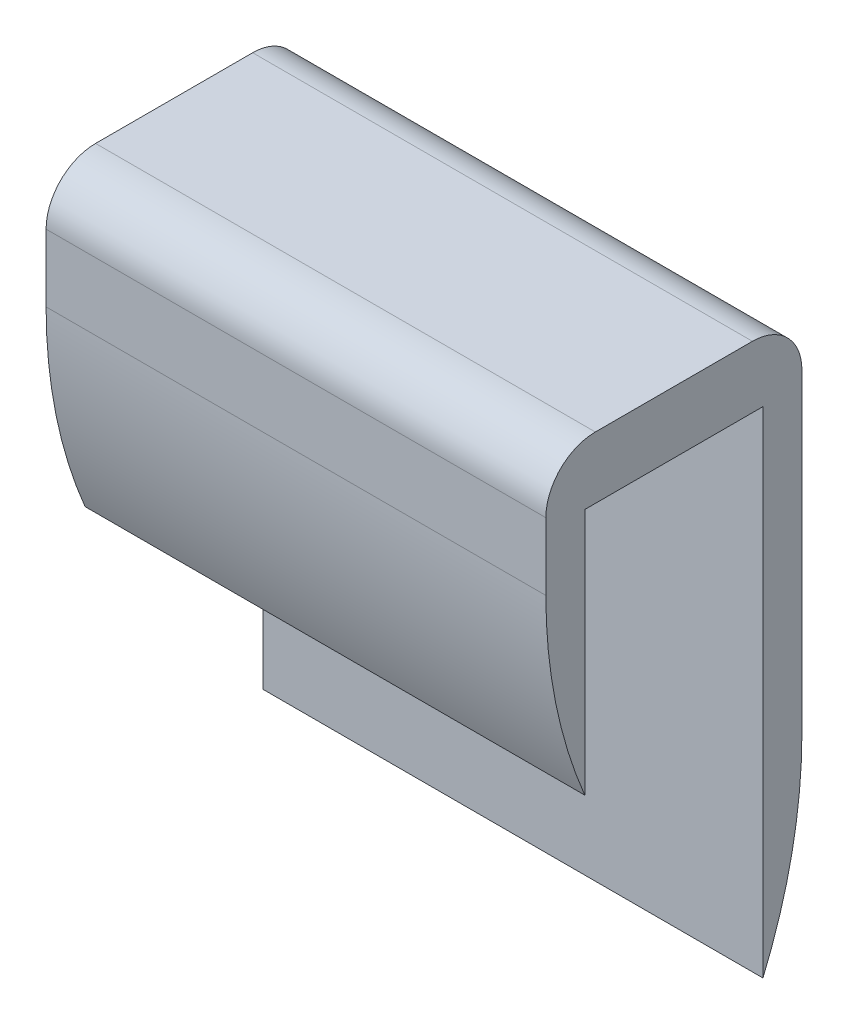
ISO-10303-21;
HEADER;
FILE_DESCRIPTION(('STEP AP214'),'2;1');
FILE_NAME('part.step','',(''),(''),'','','');
FILE_SCHEMA(('AUTOMOTIVE_DESIGN { 1 0 10303 214 1 1 1 1 }'));
ENDSEC;
DATA;
#1=APPLICATION_CONTEXT('core data for automotive mechanical design processes');
#2=APPLICATION_PROTOCOL_DEFINITION('international standard','automotive_design',2000,#1);
#3=PRODUCT_CONTEXT('',#1,'mechanical');
#4=PRODUCT('Part','Part','',(#3));
#5=PRODUCT_RELATED_PRODUCT_CATEGORY('part','',(#4));
#6=PRODUCT_DEFINITION_FORMATION('','',#4);
#7=PRODUCT_DEFINITION_CONTEXT('part definition',#1,'design');
#8=PRODUCT_DEFINITION('design','',#6,#7);
#9=PRODUCT_DEFINITION_SHAPE('','',#8);
#10=(LENGTH_UNIT() NAMED_UNIT(*) SI_UNIT(.MILLI.,.METRE.));
#11=(NAMED_UNIT(*) PLANE_ANGLE_UNIT() SI_UNIT($,.RADIAN.));
#12=(NAMED_UNIT(*) SI_UNIT($,.STERADIAN.) SOLID_ANGLE_UNIT());
#13=UNCERTAINTY_MEASURE_WITH_UNIT(LENGTH_MEASURE(1.E-05),#10,'distance_accuracy_value','');
#14=(GEOMETRIC_REPRESENTATION_CONTEXT(3) GLOBAL_UNCERTAINTY_ASSIGNED_CONTEXT((#13)) GLOBAL_UNIT_ASSIGNED_CONTEXT((#10,
#11,#12)) REPRESENTATION_CONTEXT('',''));
#15=CARTESIAN_POINT('',(0.,0.,0.));
#16=DIRECTION('',(0.,0.,1.));
#17=DIRECTION('',(1.,0.,0.));
#18=AXIS2_PLACEMENT_3D('',#15,#16,#17);
#19=CARTESIAN_POINT('',(25.654,3.175,6.572));
#20=DIRECTION('',(0.,0.,-1.));
#21=DIRECTION('',(0.,1.,0.));
#22=AXIS2_PLACEMENT_3D('',#19,#20,#21);
#23=PLANE('',#22);
#24=DIRECTION('',(0.,-1.,0.));
#25=VECTOR('',#24,1.);
#26=CARTESIAN_POINT('',(25.654,3.175,6.572));
#27=LINE('',#26,#25);
#28=CARTESIAN_POINT('',(25.654,0.634999999999998,6.572));
#29=VERTEX_POINT('',#28);
#30=CARTESIAN_POINT('',(25.654,-2.82072877181723,6.572));
#31=VERTEX_POINT('',#30);
#32=EDGE_CURVE('E116',#29,#31,#27,.T.);
#33=ORIENTED_EDGE('',*,*,#32,.F.);
#34=DIRECTION('',(-1.,0.,0.));
#35=VECTOR('',#34,1.);
#36=CARTESIAN_POINT('',(25.654,0.634999999999998,6.572));
#37=LINE('',#36,#35);
#38=CARTESIAN_POINT('',(0.,0.634999999999998,6.572));
#39=VERTEX_POINT('',#38);
#40=EDGE_CURVE('E11',#29,#39,#37,.T.);
#41=ORIENTED_EDGE('',*,*,#40,.T.);
#42=DIRECTION('',(0.,-1.,0.));
#43=VECTOR('',#42,1.);
#44=CARTESIAN_POINT('',(0.,3.175,6.572));
#45=LINE('',#44,#43);
#46=CARTESIAN_POINT('',(0.,-2.82072877181723,6.572));
#47=VERTEX_POINT('',#46);
#48=EDGE_CURVE('E207',#39,#47,#45,.T.);
#49=ORIENTED_EDGE('',*,*,#48,.T.);
#50=DIRECTION('',(1.,0.,0.));
#51=VECTOR('',#50,1.);
#52=CARTESIAN_POINT('',(25.654,-2.82072877181723,6.572));
#53=LINE('',#52,#51);
#54=EDGE_CURVE('E145',#47,#31,#53,.T.);
#55=ORIENTED_EDGE('',*,*,#54,.T.);
#56=EDGE_LOOP('',(#33,#41,#49,#55));
#57=FACE_BOUND('',#56,.T.);
#58=ADVANCED_FACE('F33',(#57),#23,.F.);
#59=CARTESIAN_POINT('',(25.654,-12.7,4.572));
#60=DIRECTION('',(0.,0.,1.));
#61=DIRECTION('',(1.,0.,0.));
#62=AXIS2_PLACEMENT_3D('',#59,#60,#61);
#63=PLANE('',#62);
#64=DIRECTION('',(0.,1.,0.));
#65=VECTOR('',#64,1.);
#66=CARTESIAN_POINT('',(0.,-12.7,4.572));
#67=LINE('',#66,#65);
#68=CARTESIAN_POINT('',(0.,-12.7,4.572));
#69=VERTEX_POINT('',#68);
#70=CARTESIAN_POINT('',(0.,0.,4.572));
#71=VERTEX_POINT('',#70);
#72=EDGE_CURVE('E209',#69,#71,#67,.T.);
#73=ORIENTED_EDGE('',*,*,#72,.T.);
#74=DIRECTION('',(-1.,0.,0.));
#75=VECTOR('',#74,1.);
#76=CARTESIAN_POINT('',(25.654,0.,4.572));
#77=LINE('',#76,#75);
#78=CARTESIAN_POINT('',(25.654,0.,4.572));
#79=VERTEX_POINT('',#78);
#80=EDGE_CURVE('E130',#79,#71,#77,.T.);
#81=ORIENTED_EDGE('',*,*,#80,.F.);
#82=DIRECTION('',(0.,1.,0.));
#83=VECTOR('',#82,1.);
#84=CARTESIAN_POINT('',(25.654,-12.7,4.572));
#85=LINE('',#84,#83);
#86=CARTESIAN_POINT('',(25.654,-12.7,4.572));
#87=VERTEX_POINT('',#86);
#88=EDGE_CURVE('E114',#87,#79,#85,.T.);
#89=ORIENTED_EDGE('',*,*,#88,.F.);
#90=DIRECTION('',(-1.,0.,0.));
#91=VECTOR('',#90,1.);
#92=CARTESIAN_POINT('',(25.654,-12.7,4.572));
#93=LINE('',#92,#91);
#94=EDGE_CURVE('E127',#87,#69,#93,.T.);
#95=ORIENTED_EDGE('',*,*,#94,.T.);
#96=EDGE_LOOP('',(#73,#81,#89,#95));
#97=FACE_BOUND('',#96,.T.);
#98=ADVANCED_FACE('F126',(#97),#63,.F.);
#99=CARTESIAN_POINT('',(25.654,0.,4.572));
#100=DIRECTION('',(0.,1.,0.));
#101=DIRECTION('',(0.,0.,1.));
#102=AXIS2_PLACEMENT_3D('',#99,#100,#101);
#103=PLANE('',#102);
#104=DIRECTION('',(0.,0.,-1.));
#105=VECTOR('',#104,1.);
#106=CARTESIAN_POINT('',(0.,0.,4.572));
#107=LINE('',#106,#105);
#108=CARTESIAN_POINT('',(0.,0.,-4.572));
#109=VERTEX_POINT('',#108);
#110=EDGE_CURVE('E185',#71,#109,#107,.T.);
#111=ORIENTED_EDGE('',*,*,#110,.T.);
#112=DIRECTION('',(-1.,0.,0.));
#113=VECTOR('',#112,1.);
#114=CARTESIAN_POINT('',(25.654,0.,-4.572));
#115=LINE('',#114,#113);
#116=CARTESIAN_POINT('',(25.654,0.,-4.572));
#117=VERTEX_POINT('',#116);
#118=EDGE_CURVE('E140',#117,#109,#115,.T.);
#119=ORIENTED_EDGE('',*,*,#118,.F.);
#120=DIRECTION('',(0.,0.,-1.));
#121=VECTOR('',#120,1.);
#122=CARTESIAN_POINT('',(25.654,0.,4.572));
#123=LINE('',#122,#121);
#124=EDGE_CURVE('E132',#79,#117,#123,.T.);
#125=ORIENTED_EDGE('',*,*,#124,.F.);
#126=ORIENTED_EDGE('',*,*,#80,.T.);
#127=EDGE_LOOP('',(#111,#119,#125,#126));
#128=FACE_BOUND('',#127,.T.);
#129=ADVANCED_FACE('F210',(#128),#103,.F.);
#130=CARTESIAN_POINT('',(25.654,0.,-4.572));
#131=DIRECTION('',(0.,0.,-1.));
#132=DIRECTION('',(0.,1.,0.));
#133=AXIS2_PLACEMENT_3D('',#130,#131,#132);
#134=PLANE('',#133);
#135=DIRECTION('',(0.,-1.,0.));
#136=VECTOR('',#135,1.);
#137=CARTESIAN_POINT('',(0.,0.,-4.572));
#138=LINE('',#137,#136);
#139=CARTESIAN_POINT('',(0.,-25.4,-4.572));
#140=VERTEX_POINT('',#139);
#141=EDGE_CURVE('E181',#109,#140,#138,.T.);
#142=ORIENTED_EDGE('',*,*,#141,.T.);
#143=DIRECTION('',(-1.,0.,0.));
#144=VECTOR('',#143,1.);
#145=CARTESIAN_POINT('',(25.654,-25.4,-4.572));
#146=LINE('',#145,#144);
#147=CARTESIAN_POINT('',(25.654,-25.4,-4.572));
#148=VERTEX_POINT('',#147);
#149=EDGE_CURVE('E171',#148,#140,#146,.T.);
#150=ORIENTED_EDGE('',*,*,#149,.F.);
#151=DIRECTION('',(0.,-1.,0.));
#152=VECTOR('',#151,1.);
#153=CARTESIAN_POINT('',(25.654,0.,-4.572));
#154=LINE('',#153,#152);
#155=EDGE_CURVE('E197',#117,#148,#154,.T.);
#156=ORIENTED_EDGE('',*,*,#155,.F.);
#157=ORIENTED_EDGE('',*,*,#118,.T.);
#158=EDGE_LOOP('',(#142,#150,#156,#157));
#159=FACE_BOUND('',#158,.T.);
#160=ADVANCED_FACE('F195',(#159),#134,.F.);
#161=CARTESIAN_POINT('',(25.654,-25.4,-6.572));
#162=DIRECTION('',(0.,0.,1.));
#163=DIRECTION('',(1.,0.,0.));
#164=AXIS2_PLACEMENT_3D('',#161,#162,#163);
#165=PLANE('',#164);
#166=DIRECTION('',(0.,1.,0.));
#167=VECTOR('',#166,1.);
#168=CARTESIAN_POINT('',(0.,-25.4,-6.572));
#169=LINE('',#168,#167);
#170=CARTESIAN_POINT('',(0.,-15.5207287718172,-6.572));
#171=VERTEX_POINT('',#170);
#172=CARTESIAN_POINT('',(0.,0.635,-6.572));
#173=VERTEX_POINT('',#172);
#174=EDGE_CURVE('E177',#171,#173,#169,.T.);
#175=ORIENTED_EDGE('',*,*,#174,.T.);
#176=DIRECTION('',(-1.,0.,0.));
#177=VECTOR('',#176,1.);
#178=CARTESIAN_POINT('',(25.654,0.635,-6.572));
#179=LINE('',#178,#177);
#180=CARTESIAN_POINT('',(25.654,0.635,-6.572));
#181=VERTEX_POINT('',#180);
#182=EDGE_CURVE('E56',#173,#181,#179,.F.);
#183=ORIENTED_EDGE('',*,*,#182,.T.);
#184=DIRECTION('',(0.,1.,0.));
#185=VECTOR('',#184,1.);
#186=CARTESIAN_POINT('',(25.654,-25.4,-6.572));
#187=LINE('',#186,#185);
#188=CARTESIAN_POINT('',(25.654,-15.5207287718172,-6.572));
#189=VERTEX_POINT('',#188);
#190=EDGE_CURVE('E163',#189,#181,#187,.T.);
#191=ORIENTED_EDGE('',*,*,#190,.F.);
#192=DIRECTION('',(-1.,0.,0.));
#193=VECTOR('',#192,1.);
#194=CARTESIAN_POINT('',(25.654,-15.5207287718172,-6.572));
#195=LINE('',#194,#193);
#196=EDGE_CURVE('E121',#189,#171,#195,.T.);
#197=ORIENTED_EDGE('',*,*,#196,.T.);
#198=EDGE_LOOP('',(#175,#183,#191,#197));
#199=FACE_BOUND('',#198,.T.);
#200=ADVANCED_FACE('F179',(#199),#165,.F.);
#201=CARTESIAN_POINT('',(25.654,3.175,-6.572));
#202=DIRECTION('',(0.,-1.,0.));
#203=DIRECTION('',(0.,0.,-1.));
#204=AXIS2_PLACEMENT_3D('',#201,#202,#203);
#205=PLANE('',#204);
#206=DIRECTION('',(0.,0.,1.));
#207=VECTOR('',#206,1.);
#208=CARTESIAN_POINT('',(25.654,3.175,-6.572));
#209=LINE('',#208,#207);
#210=CARTESIAN_POINT('',(25.654,3.175,-4.032));
#211=VERTEX_POINT('',#210);
#212=CARTESIAN_POINT('',(25.654,3.175,4.032));
#213=VERTEX_POINT('',#212);
#214=EDGE_CURVE('E162',#211,#213,#209,.T.);
#215=ORIENTED_EDGE('',*,*,#214,.F.);
#216=DIRECTION('',(-1.,0.,0.));
#217=VECTOR('',#216,1.);
#218=CARTESIAN_POINT('',(25.654,3.175,-4.032));
#219=LINE('',#218,#217);
#220=CARTESIAN_POINT('',(0.,3.175,-4.032));
#221=VERTEX_POINT('',#220);
#222=EDGE_CURVE('E152',#211,#221,#219,.T.);
#223=ORIENTED_EDGE('',*,*,#222,.T.);
#224=DIRECTION('',(0.,0.,1.));
#225=VECTOR('',#224,1.);
#226=CARTESIAN_POINT('',(0.,3.175,-6.572));
#227=LINE('',#226,#225);
#228=CARTESIAN_POINT('',(0.,3.175,4.032));
#229=VERTEX_POINT('',#228);
#230=EDGE_CURVE('E178',#221,#229,#227,.T.);
#231=ORIENTED_EDGE('',*,*,#230,.T.);
#232=DIRECTION('',(-1.,0.,0.));
#233=VECTOR('',#232,1.);
#234=CARTESIAN_POINT('',(25.654,3.175,4.032));
#235=LINE('',#234,#233);
#236=EDGE_CURVE('E150',#229,#213,#235,.F.);
#237=ORIENTED_EDGE('',*,*,#236,.T.);
#238=EDGE_LOOP('',(#215,#223,#231,#237));
#239=FACE_BOUND('',#238,.T.);
#240=ADVANCED_FACE('F167',(#239),#205,.F.);
#241=CARTESIAN_POINT('',(25.654,0.,0.));
#242=DIRECTION('',(1.,0.,0.));
#243=DIRECTION('',(0.,0.,-1.));
#244=AXIS2_PLACEMENT_3D('',#241,#242,#243);
#245=PLANE('',#244);
#246=ORIENTED_EDGE('',*,*,#190,.T.);
#247=CARTESIAN_POINT('',(25.654,0.635,-4.032));
#248=DIRECTION('',(1.,0.,0.));
#249=DIRECTION('',(0.,0.,-1.));
#250=AXIS2_PLACEMENT_3D('',#247,#248,#249);
#251=CIRCLE('',#250,2.54);
#252=EDGE_CURVE('E41',#181,#211,#251,.T.);
#253=ORIENTED_EDGE('',*,*,#252,.T.);
#254=ORIENTED_EDGE('',*,*,#214,.T.);
#255=CARTESIAN_POINT('',(25.654,0.634999999999998,4.032));
#256=DIRECTION('',(1.,0.,0.));
#257=DIRECTION('',(0.,0.,-1.));
#258=AXIS2_PLACEMENT_3D('',#255,#256,#257);
#259=CIRCLE('',#258,2.54);
#260=EDGE_CURVE('E48',#213,#29,#259,.T.);
#261=ORIENTED_EDGE('',*,*,#260,.T.);
#262=ORIENTED_EDGE('',*,*,#32,.T.);
#263=CARTESIAN_POINT('',(25.654,-2.82072877181722,-18.828));
#264=DIRECTION('',(1.,0.,0.));
#265=DIRECTION('',(0.,0.,-1.));
#266=AXIS2_PLACEMENT_3D('',#263,#264,#265);
#267=CIRCLE('',#266,25.4);
#268=EDGE_CURVE('E111',#31,#87,#267,.T.);
#269=ORIENTED_EDGE('',*,*,#268,.T.);
#270=ORIENTED_EDGE('',*,*,#88,.T.);
#271=ORIENTED_EDGE('',*,*,#124,.T.);
#272=ORIENTED_EDGE('',*,*,#155,.T.);
#273=CARTESIAN_POINT('',(25.654,-15.5207287718172,18.828));
#274=DIRECTION('',(1.,0.,0.));
#275=DIRECTION('',(0.,0.,-1.));
#276=AXIS2_PLACEMENT_3D('',#273,#274,#275);
#277=CIRCLE('',#276,25.4);
#278=EDGE_CURVE('E122',#148,#189,#277,.T.);
#279=ORIENTED_EDGE('',*,*,#278,.T.);
#280=EDGE_LOOP('',(#246,#253,#254,#261,#262,#269,#270,#271,#272,#279));
#281=FACE_BOUND('',#280,.T.);
#282=ADVANCED_FACE('F113',(#281),#245,.T.);
#283=CARTESIAN_POINT('',(0.,0.,0.));
#284=DIRECTION('',(1.,0.,0.));
#285=DIRECTION('',(0.,0.,-1.));
#286=AXIS2_PLACEMENT_3D('',#283,#284,#285);
#287=PLANE('',#286);
#288=ORIENTED_EDGE('',*,*,#230,.F.);
#289=CARTESIAN_POINT('',(0.,0.635,-4.032));
#290=DIRECTION('',(1.,0.,0.));
#291=DIRECTION('',(0.,0.,-1.));
#292=AXIS2_PLACEMENT_3D('',#289,#290,#291);
#293=CIRCLE('',#292,2.54);
#294=EDGE_CURVE('E157',#221,#173,#293,.F.);
#295=ORIENTED_EDGE('',*,*,#294,.T.);
#296=ORIENTED_EDGE('',*,*,#174,.F.);
#297=CARTESIAN_POINT('',(0.,-15.5207287718172,18.828));
#298=DIRECTION('',(1.,0.,0.));
#299=DIRECTION('',(0.,0.,-1.));
#300=AXIS2_PLACEMENT_3D('',#297,#298,#299);
#301=CIRCLE('',#300,25.4);
#302=EDGE_CURVE('E137',#171,#140,#301,.F.);
#303=ORIENTED_EDGE('',*,*,#302,.T.);
#304=ORIENTED_EDGE('',*,*,#141,.F.);
#305=ORIENTED_EDGE('',*,*,#110,.F.);
#306=ORIENTED_EDGE('',*,*,#72,.F.);
#307=CARTESIAN_POINT('',(0.,-2.82072877181722,-18.828));
#308=DIRECTION('',(1.,0.,0.));
#309=DIRECTION('',(0.,0.,-1.));
#310=AXIS2_PLACEMENT_3D('',#307,#308,#309);
#311=CIRCLE('',#310,25.4);
#312=EDGE_CURVE('E136',#69,#47,#311,.F.);
#313=ORIENTED_EDGE('',*,*,#312,.T.);
#314=ORIENTED_EDGE('',*,*,#48,.F.);
#315=CARTESIAN_POINT('',(0.,0.634999999999998,4.032));
#316=DIRECTION('',(1.,0.,0.));
#317=DIRECTION('',(0.,0.,-1.));
#318=AXIS2_PLACEMENT_3D('',#315,#316,#317);
#319=CIRCLE('',#318,2.54);
#320=EDGE_CURVE('E155',#39,#229,#319,.F.);
#321=ORIENTED_EDGE('',*,*,#320,.T.);
#322=EDGE_LOOP('',(#288,#295,#296,#303,#304,#305,#306,#313,#314,#321));
#323=FACE_BOUND('',#322,.T.);
#324=ADVANCED_FACE('F176',(#323),#287,.F.);
#325=CARTESIAN_POINT('',(25.654,-2.82072877181722,-18.828));
#326=DIRECTION('',(1.,0.,0.));
#327=DIRECTION('',(0.,0.,-1.));
#328=AXIS2_PLACEMENT_3D('',#325,#326,#327);
#329=CYLINDRICAL_SURFACE('',#328,25.4);
#330=ORIENTED_EDGE('',*,*,#268,.F.);
#331=ORIENTED_EDGE('',*,*,#54,.F.);
#332=ORIENTED_EDGE('',*,*,#312,.F.);
#333=ORIENTED_EDGE('',*,*,#94,.F.);
#334=EDGE_LOOP('',(#330,#331,#332,#333));
#335=FACE_BOUND('',#334,.T.);
#336=ADVANCED_FACE('F134',(#335),#329,.T.);
#337=CARTESIAN_POINT('',(25.654,-15.5207287718172,18.828));
#338=DIRECTION('',(-1.,0.,0.));
#339=DIRECTION('',(0.,0.,1.));
#340=AXIS2_PLACEMENT_3D('',#337,#338,#339);
#341=CYLINDRICAL_SURFACE('',#340,25.4);
#342=ORIENTED_EDGE('',*,*,#278,.F.);
#343=ORIENTED_EDGE('',*,*,#149,.T.);
#344=ORIENTED_EDGE('',*,*,#302,.F.);
#345=ORIENTED_EDGE('',*,*,#196,.F.);
#346=EDGE_LOOP('',(#342,#343,#344,#345));
#347=FACE_BOUND('',#346,.T.);
#348=ADVANCED_FACE('F202',(#347),#341,.T.);
#349=CARTESIAN_POINT('',(25.654,0.635,-4.032));
#350=DIRECTION('',(-1.,0.,0.));
#351=DIRECTION('',(0.,0.,1.));
#352=AXIS2_PLACEMENT_3D('',#349,#350,#351);
#353=CYLINDRICAL_SURFACE('',#352,2.54);
#354=ORIENTED_EDGE('',*,*,#252,.F.);
#355=ORIENTED_EDGE('',*,*,#182,.F.);
#356=ORIENTED_EDGE('',*,*,#294,.F.);
#357=ORIENTED_EDGE('',*,*,#222,.F.);
#358=EDGE_LOOP('',(#354,#355,#356,#357));
#359=FACE_BOUND('',#358,.T.);
#360=ADVANCED_FACE('F173',(#359),#353,.T.);
#361=CARTESIAN_POINT('',(25.654,0.634999999999998,4.032));
#362=DIRECTION('',(-1.,0.,0.));
#363=DIRECTION('',(0.,0.,1.));
#364=AXIS2_PLACEMENT_3D('',#361,#362,#363);
#365=CYLINDRICAL_SURFACE('',#364,2.54);
#366=ORIENTED_EDGE('',*,*,#260,.F.);
#367=ORIENTED_EDGE('',*,*,#236,.F.);
#368=ORIENTED_EDGE('',*,*,#320,.F.);
#369=ORIENTED_EDGE('',*,*,#40,.F.);
#370=EDGE_LOOP('',(#366,#367,#368,#369));
#371=FACE_BOUND('',#370,.T.);
#372=ADVANCED_FACE('F35',(#371),#365,.T.);
#373=CLOSED_SHELL('',(#58,#98,#129,#160,#200,#240,#282,#324,#336,#348,#360,#372));
#374=MANIFOLD_SOLID_BREP('B2',#373);
#375=ADVANCED_BREP_SHAPE_REPRESENTATION('',(#18,#374),#14);
#376=SHAPE_DEFINITION_REPRESENTATION(#9,#375);
ENDSEC;
END-ISO-10303-21;
